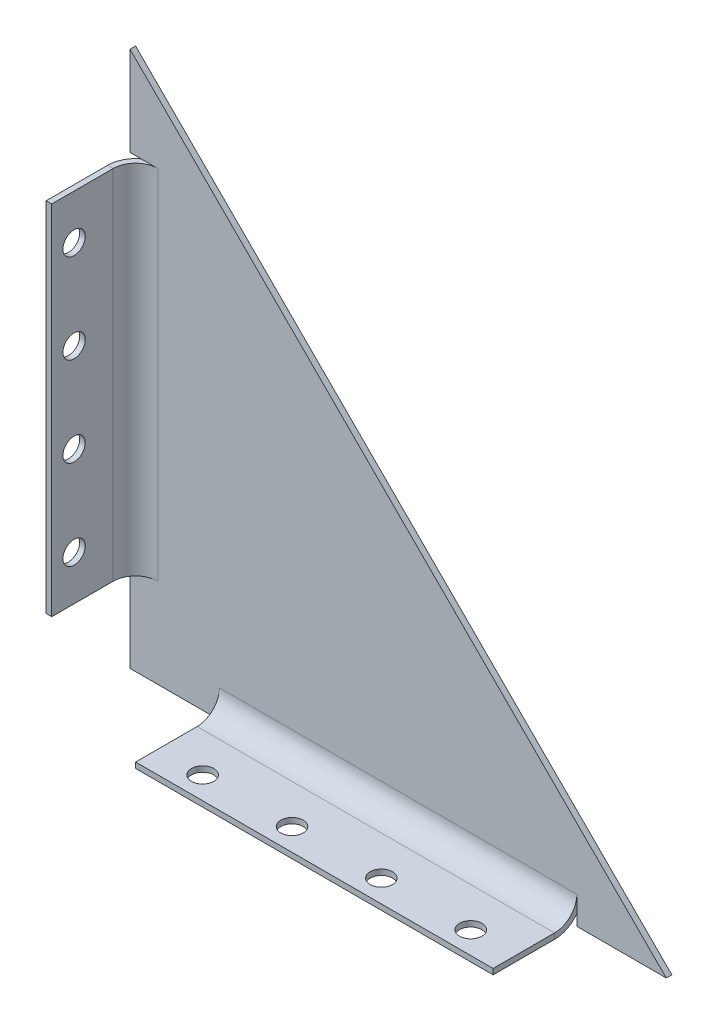
ISO-10303-21;
HEADER;
FILE_DESCRIPTION(('STEP AP214'),'2;1');
FILE_NAME('part.step','',(''),(''),'','','');
FILE_SCHEMA(('AUTOMOTIVE_DESIGN { 1 0 10303 214 1 1 1 1 }'));
ENDSEC;
DATA;
#1=APPLICATION_CONTEXT('core data for automotive mechanical design processes');
#2=APPLICATION_PROTOCOL_DEFINITION('international standard','automotive_design',2000,#1);
#3=PRODUCT_CONTEXT('',#1,'mechanical');
#4=PRODUCT('Part','Part','',(#3));
#5=PRODUCT_RELATED_PRODUCT_CATEGORY('part','',(#4));
#6=PRODUCT_DEFINITION_FORMATION('','',#4);
#7=PRODUCT_DEFINITION_CONTEXT('part definition',#1,'design');
#8=PRODUCT_DEFINITION('design','',#6,#7);
#9=PRODUCT_DEFINITION_SHAPE('','',#8);
#10=(LENGTH_UNIT() NAMED_UNIT(*) SI_UNIT(.MILLI.,.METRE.));
#11=(NAMED_UNIT(*) PLANE_ANGLE_UNIT() SI_UNIT($,.RADIAN.));
#12=(NAMED_UNIT(*) SI_UNIT($,.STERADIAN.) SOLID_ANGLE_UNIT());
#13=UNCERTAINTY_MEASURE_WITH_UNIT(LENGTH_MEASURE(1.E-05),#10,'distance_accuracy_value','');
#14=(GEOMETRIC_REPRESENTATION_CONTEXT(3) GLOBAL_UNCERTAINTY_ASSIGNED_CONTEXT((#13)) GLOBAL_UNIT_ASSIGNED_CONTEXT((#10,
#11,#12)) REPRESENTATION_CONTEXT('',''));
#15=CARTESIAN_POINT('',(0.,0.,0.));
#16=DIRECTION('',(0.,0.,1.));
#17=DIRECTION('',(1.,0.,0.));
#18=AXIS2_PLACEMENT_3D('',#15,#16,#17);
#19=CARTESIAN_POINT('',(127.,-32.9435568006634,1.58750000000001));
#20=DIRECTION('',(-1.,0.,0.));
#21=DIRECTION('',(0.,0.,1.));
#22=AXIS2_PLACEMENT_3D('',#19,#20,#21);
#23=PLANE('',#22);
#24=DIRECTION('',(0.,1.,0.));
#25=VECTOR('',#24,1.);
#26=CARTESIAN_POINT('',(127.,-32.9435568006634,1.58750000000001));
#27=LINE('',#26,#25);
#28=CARTESIAN_POINT('',(127.,-32.9181568006634,1.58750000000001));
#29=VERTEX_POINT('',#28);
#30=CARTESIAN_POINT('',(127.,-29.7685568006634,1.58750000000001));
#31=VERTEX_POINT('',#30);
#32=EDGE_CURVE('E287',#29,#31,#27,.T.);
#33=ORIENTED_EDGE('',*,*,#32,.T.);
#34=CARTESIAN_POINT('',(127.,-25.0060568006634,7.93750000000001));
#35=DIRECTION('',(1.,0.,0.));
#36=DIRECTION('',(0.,0.,-1.));
#37=AXIS2_PLACEMENT_3D('',#34,#35,#36);
#38=CIRCLE('',#37,7.9375);
#39=CARTESIAN_POINT('',(127.,-25.0060568006634,0.));
#40=VERTEX_POINT('',#39);
#41=EDGE_CURVE('E13',#31,#40,#38,.T.);
#42=ORIENTED_EDGE('',*,*,#41,.T.);
#43=DIRECTION('',(0.,-1.,0.));
#44=VECTOR('',#43,1.);
#45=CARTESIAN_POINT('',(127.,0.,0.));
#46=LINE('',#45,#44);
#47=CARTESIAN_POINT('',(127.,-32.9181568006634,0.));
#48=VERTEX_POINT('',#47);
#49=EDGE_CURVE('E293',#40,#48,#46,.T.);
#50=ORIENTED_EDGE('',*,*,#49,.T.);
#51=DIRECTION('',(0.,0.,1.));
#52=VECTOR('',#51,1.);
#53=CARTESIAN_POINT('',(127.,-32.9181568006634,1.58750000000001));
#54=LINE('',#53,#52);
#55=EDGE_CURVE('E306',#48,#29,#54,.T.);
#56=ORIENTED_EDGE('',*,*,#55,.T.);
#57=EDGE_LOOP('',(#33,#42,#50,#56));
#58=FACE_BOUND('',#57,.T.);
#59=ADVANCED_FACE('F79',(#58),#23,.T.);
#60=CARTESIAN_POINT('',(25.4,-25.0060568006634,1.5875));
#61=DIRECTION('',(1.,0.,0.));
#62=DIRECTION('',(0.,1.,0.));
#63=AXIS2_PLACEMENT_3D('',#60,#61,#62);
#64=PLANE('',#63);
#65=DIRECTION('',(0.,1.,0.));
#66=VECTOR('',#65,1.);
#67=CARTESIAN_POINT('',(25.4,0.,0.));
#68=LINE('',#67,#66);
#69=CARTESIAN_POINT('',(25.4,-32.9181568006634,0.));
#70=VERTEX_POINT('',#69);
#71=CARTESIAN_POINT('',(25.4,-25.0060568006634,0.));
#72=VERTEX_POINT('',#71);
#73=EDGE_CURVE('E290',#70,#72,#68,.T.);
#74=ORIENTED_EDGE('',*,*,#73,.T.);
#75=CARTESIAN_POINT('',(25.4,-25.0060568006634,7.9375));
#76=DIRECTION('',(1.,0.,0.));
#77=DIRECTION('',(0.,0.,-1.));
#78=AXIS2_PLACEMENT_3D('',#75,#76,#77);
#79=CIRCLE('',#78,7.9375);
#80=CARTESIAN_POINT('',(25.4,-29.7685568006634,1.5875));
#81=VERTEX_POINT('',#80);
#82=EDGE_CURVE('E270',#72,#81,#79,.F.);
#83=ORIENTED_EDGE('',*,*,#82,.T.);
#84=DIRECTION('',(0.,-1.,0.));
#85=VECTOR('',#84,1.);
#86=CARTESIAN_POINT('',(25.4,-25.0060568006634,1.5875));
#87=LINE('',#86,#85);
#88=CARTESIAN_POINT('',(25.4,-32.9181568006634,1.5875));
#89=VERTEX_POINT('',#88);
#90=EDGE_CURVE('E272',#81,#89,#87,.T.);
#91=ORIENTED_EDGE('',*,*,#90,.T.);
#92=DIRECTION('',(0.,0.,-1.));
#93=VECTOR('',#92,1.);
#94=CARTESIAN_POINT('',(25.4,-32.9181568006634,1.5875));
#95=LINE('',#94,#93);
#96=EDGE_CURVE('E296',#89,#70,#95,.T.);
#97=ORIENTED_EDGE('',*,*,#96,.T.);
#98=EDGE_LOOP('',(#74,#83,#91,#97));
#99=FACE_BOUND('',#98,.T.);
#100=ADVANCED_FACE('F317',(#99),#64,.T.);
#101=CARTESIAN_POINT('',(0.,0.,1.5875));
#102=DIRECTION('',(0.,0.,1.));
#103=DIRECTION('',(1.,0.,0.));
#104=AXIS2_PLACEMENT_3D('',#101,#102,#103);
#105=PLANE('',#104);
#106=DIRECTION('',(1.,0.,0.));
#107=VECTOR('',#106,1.);
#108=CARTESIAN_POINT('',(127.,-25.0060568006634,1.58750000000001));
#109=LINE('',#108,#107);
#110=CARTESIAN_POINT('',(127.,-25.0060568006634,1.5875));
#111=VERTEX_POINT('',#110);
#112=CARTESIAN_POINT('',(25.4,-25.0060568006634,1.5875));
#113=VERTEX_POINT('',#112);
#114=EDGE_CURVE('E102',#111,#113,#109,.F.);
#115=ORIENTED_EDGE('',*,*,#114,.F.);
#116=EDGE_CURVE('E83',#31,#111,#27,.T.);
#117=ORIENTED_EDGE('',*,*,#116,.F.);
#118=ORIENTED_EDGE('',*,*,#32,.F.);
#119=DIRECTION('',(1.,0.,0.));
#120=VECTOR('',#119,1.);
#121=CARTESIAN_POINT('',(0.,-32.9181568006634,1.5875));
#122=LINE('',#121,#120);
#123=CARTESIAN_POINT('',(152.4,-32.9181568006634,1.5875));
#124=VERTEX_POINT('',#123);
#125=EDGE_CURVE('E386',#29,#124,#122,.T.);
#126=ORIENTED_EDGE('',*,*,#125,.T.);
#127=DIRECTION('',(-0.707106781186548,0.707106781186547,0.));
#128=VECTOR('',#127,1.);
#129=CARTESIAN_POINT('',(152.4,-32.9181568006634,1.5875));
#130=LINE('',#129,#128);
#131=CARTESIAN_POINT('',(0.,119.481843199337,1.5875));
#132=VERTEX_POINT('',#131);
#133=EDGE_CURVE('E354',#124,#132,#130,.T.);
#134=ORIENTED_EDGE('',*,*,#133,.T.);
#135=DIRECTION('',(0.,-1.,0.));
#136=VECTOR('',#135,1.);
#137=CARTESIAN_POINT('',(0.,119.481843199337,1.5875));
#138=LINE('',#137,#136);
#139=CARTESIAN_POINT('',(0.,94.0818431993366,1.5875));
#140=VERTEX_POINT('',#139);
#141=EDGE_CURVE('E394',#132,#140,#138,.T.);
#142=ORIENTED_EDGE('',*,*,#141,.T.);
#143=DIRECTION('',(-1.,0.,0.));
#144=VECTOR('',#143,1.);
#145=CARTESIAN_POINT('',(7.91209999999998,94.0818431993366,1.5875));
#146=LINE('',#145,#144);
#147=CARTESIAN_POINT('',(3.14959999999997,94.0818431993366,1.5875));
#148=VERTEX_POINT('',#147);
#149=EDGE_CURVE('E435',#148,#140,#146,.T.);
#150=ORIENTED_EDGE('',*,*,#149,.F.);
#151=CARTESIAN_POINT('',(7.91209999999998,94.0818431993366,1.5875));
#152=VERTEX_POINT('',#151);
#153=EDGE_CURVE('E437',#152,#148,#146,.T.);
#154=ORIENTED_EDGE('',*,*,#153,.F.);
#155=DIRECTION('',(0.,-1.,0.));
#156=VECTOR('',#155,1.);
#157=CARTESIAN_POINT('',(7.91209999999998,-7.51815680066342,1.58750000000001));
#158=LINE('',#157,#156);
#159=CARTESIAN_POINT('',(7.91209999999998,-7.51815680066342,1.5875));
#160=VERTEX_POINT('',#159);
#161=EDGE_CURVE('E469',#160,#152,#158,.F.);
#162=ORIENTED_EDGE('',*,*,#161,.F.);
#163=DIRECTION('',(1.,0.,0.));
#164=VECTOR('',#163,1.);
#165=CARTESIAN_POINT('',(-0.0254,-7.51815680066342,1.58750000000001));
#166=LINE('',#165,#164);
#167=CARTESIAN_POINT('',(3.14959999999997,-7.51815680066342,1.58750000000001));
#168=VERTEX_POINT('',#167);
#169=EDGE_CURVE('E439',#168,#160,#166,.T.);
#170=ORIENTED_EDGE('',*,*,#169,.F.);
#171=CARTESIAN_POINT('',(0.,-7.51815680066342,1.58750000000001));
#172=VERTEX_POINT('',#171);
#173=EDGE_CURVE('E425',#172,#168,#166,.T.);
#174=ORIENTED_EDGE('',*,*,#173,.F.);
#175=CARTESIAN_POINT('',(0.,-32.9181568006634,1.5875));
#176=VERTEX_POINT('',#175);
#177=EDGE_CURVE('E392',#172,#176,#138,.T.);
#178=ORIENTED_EDGE('',*,*,#177,.T.);
#179=EDGE_CURVE('E362',#176,#89,#122,.T.);
#180=ORIENTED_EDGE('',*,*,#179,.T.);
#181=ORIENTED_EDGE('',*,*,#90,.F.);
#182=EDGE_CURVE('E308',#113,#81,#87,.T.);
#183=ORIENTED_EDGE('',*,*,#182,.F.);
#184=EDGE_LOOP('',(#115,#117,#118,#126,#134,#142,#150,#154,#162,#170,#174,#178,#180,#181,#183));
#185=FACE_BOUND('',#184,.T.);
#186=ADVANCED_FACE('F405',(#185),#105,.T.);
#187=CARTESIAN_POINT('',(0.,0.,0.));
#188=DIRECTION('',(0.,0.,1.));
#189=DIRECTION('',(1.,0.,0.));
#190=AXIS2_PLACEMENT_3D('',#187,#188,#189);
#191=PLANE('',#190);
#192=ORIENTED_EDGE('',*,*,#49,.F.);
#193=DIRECTION('',(1.,0.,0.));
#194=VECTOR('',#193,1.);
#195=CARTESIAN_POINT('',(127.,-25.0060568006634,0.));
#196=LINE('',#195,#194);
#197=EDGE_CURVE('E267',#40,#72,#196,.F.);
#198=ORIENTED_EDGE('',*,*,#197,.T.);
#199=ORIENTED_EDGE('',*,*,#73,.F.);
#200=DIRECTION('',(1.,0.,0.));
#201=VECTOR('',#200,1.);
#202=CARTESIAN_POINT('',(0.,-32.9181568006634,0.));
#203=LINE('',#202,#201);
#204=CARTESIAN_POINT('',(0.,-32.9181568006634,0.));
#205=VERTEX_POINT('',#204);
#206=EDGE_CURVE('E351',#205,#70,#203,.T.);
#207=ORIENTED_EDGE('',*,*,#206,.F.);
#208=DIRECTION('',(0.,1.,0.));
#209=VECTOR('',#208,1.);
#210=CARTESIAN_POINT('',(0.,0.,0.));
#211=LINE('',#210,#209);
#212=CARTESIAN_POINT('',(0.,-7.51815680066342,0.));
#213=VERTEX_POINT('',#212);
#214=EDGE_CURVE('E357',#213,#205,#211,.F.);
#215=ORIENTED_EDGE('',*,*,#214,.F.);
#216=DIRECTION('',(-1.,0.,0.));
#217=VECTOR('',#216,1.);
#218=CARTESIAN_POINT('',(0.,-7.51815680066341,0.));
#219=LINE('',#218,#217);
#220=CARTESIAN_POINT('',(7.91209999999998,-7.51815680066342,0.));
#221=VERTEX_POINT('',#220);
#222=EDGE_CURVE('E412',#221,#213,#219,.T.);
#223=ORIENTED_EDGE('',*,*,#222,.F.);
#224=DIRECTION('',(0.,-1.,0.));
#225=VECTOR('',#224,1.);
#226=CARTESIAN_POINT('',(7.91209999999998,-7.51815680066342,0.));
#227=LINE('',#226,#225);
#228=CARTESIAN_POINT('',(7.91209999999998,94.0818431993366,0.));
#229=VERTEX_POINT('',#228);
#230=EDGE_CURVE('E460',#221,#229,#227,.F.);
#231=ORIENTED_EDGE('',*,*,#230,.T.);
#232=DIRECTION('',(1.,0.,0.));
#233=VECTOR('',#232,1.);
#234=CARTESIAN_POINT('',(0.,94.0818431993366,0.));
#235=LINE('',#234,#233);
#236=CARTESIAN_POINT('',(0.,94.0818431993366,0.));
#237=VERTEX_POINT('',#236);
#238=EDGE_CURVE('E421',#237,#229,#235,.T.);
#239=ORIENTED_EDGE('',*,*,#238,.F.);
#240=CARTESIAN_POINT('',(0.,119.481843199337,0.));
#241=VERTEX_POINT('',#240);
#242=EDGE_CURVE('E352',#241,#237,#211,.F.);
#243=ORIENTED_EDGE('',*,*,#242,.F.);
#244=DIRECTION('',(-0.707106781186548,0.707106781186547,0.));
#245=VECTOR('',#244,1.);
#246=CARTESIAN_POINT('',(152.4,-32.9181568006634,0.));
#247=LINE('',#246,#245);
#248=CARTESIAN_POINT('',(152.4,-32.9181568006634,0.));
#249=VERTEX_POINT('',#248);
#250=EDGE_CURVE('E347',#249,#241,#247,.T.);
#251=ORIENTED_EDGE('',*,*,#250,.F.);
#252=EDGE_CURVE('E344',#48,#249,#203,.T.);
#253=ORIENTED_EDGE('',*,*,#252,.F.);
#254=EDGE_LOOP('',(#192,#198,#199,#207,#215,#223,#231,#239,#243,#251,#253));
#255=FACE_BOUND('',#254,.T.);
#256=ADVANCED_FACE('F342',(#255),#191,.F.);
#257=CARTESIAN_POINT('',(0.,-32.9181568006634,1.5875));
#258=DIRECTION('',(0.,-1.,0.));
#259=DIRECTION('',(1.,0.,0.));
#260=AXIS2_PLACEMENT_3D('',#257,#258,#259);
#261=PLANE('',#260);
#262=ORIENTED_EDGE('',*,*,#96,.F.);
#263=ORIENTED_EDGE('',*,*,#179,.F.);
#264=DIRECTION('',(0.,0.,1.));
#265=VECTOR('',#264,1.);
#266=CARTESIAN_POINT('',(0.,-32.9181568006634,1.5875));
#267=LINE('',#266,#265);
#268=EDGE_CURVE('E377',#205,#176,#267,.T.);
#269=ORIENTED_EDGE('',*,*,#268,.F.);
#270=ORIENTED_EDGE('',*,*,#206,.T.);
#271=EDGE_LOOP('',(#262,#263,#269,#270));
#272=FACE_BOUND('',#271,.T.);
#273=ADVANCED_FACE('F408',(#272),#261,.T.);
#274=CARTESIAN_POINT('',(-0.0254,-7.51815680066342,1.58750000000001));
#275=DIRECTION('',(0.,1.,0.));
#276=DIRECTION('',(0.,0.,1.));
#277=AXIS2_PLACEMENT_3D('',#274,#275,#276);
#278=PLANE('',#277);
#279=ORIENTED_EDGE('',*,*,#173,.T.);
#280=CARTESIAN_POINT('',(7.91209999999998,-7.51815680066342,7.93750000000001));
#281=DIRECTION('',(0.,-1.,0.));
#282=DIRECTION('',(0.,0.,-1.));
#283=AXIS2_PLACEMENT_3D('',#280,#281,#282);
#284=CIRCLE('',#283,7.9375);
#285=EDGE_CURVE('E89',#168,#221,#284,.T.);
#286=ORIENTED_EDGE('',*,*,#285,.T.);
#287=ORIENTED_EDGE('',*,*,#222,.T.);
#288=DIRECTION('',(0.,0.,1.));
#289=VECTOR('',#288,1.);
#290=CARTESIAN_POINT('',(0.,-7.51815680066342,1.58750000000001));
#291=LINE('',#290,#289);
#292=EDGE_CURVE('E418',#213,#172,#291,.T.);
#293=ORIENTED_EDGE('',*,*,#292,.T.);
#294=EDGE_LOOP('',(#279,#286,#287,#293));
#295=FACE_BOUND('',#294,.T.);
#296=ADVANCED_FACE('F417',(#295),#278,.T.);
#297=CARTESIAN_POINT('',(7.91209999999998,94.0818431993366,1.5875));
#298=DIRECTION('',(0.,-1.,0.));
#299=DIRECTION('',(0.,0.,-1.));
#300=AXIS2_PLACEMENT_3D('',#297,#298,#299);
#301=PLANE('',#300);
#302=ORIENTED_EDGE('',*,*,#238,.T.);
#303=CARTESIAN_POINT('',(7.91209999999998,94.0818431993366,7.93749999999999));
#304=DIRECTION('',(0.,-1.,0.));
#305=DIRECTION('',(0.,0.,-1.));
#306=AXIS2_PLACEMENT_3D('',#303,#304,#305);
#307=CIRCLE('',#306,7.9375);
#308=EDGE_CURVE('E438',#229,#148,#307,.F.);
#309=ORIENTED_EDGE('',*,*,#308,.T.);
#310=ORIENTED_EDGE('',*,*,#149,.T.);
#311=DIRECTION('',(0.,0.,-1.));
#312=VECTOR('',#311,1.);
#313=CARTESIAN_POINT('',(0.,94.0818431993366,1.5875));
#314=LINE('',#313,#312);
#315=EDGE_CURVE('E420',#140,#237,#314,.T.);
#316=ORIENTED_EDGE('',*,*,#315,.T.);
#317=EDGE_LOOP('',(#302,#309,#310,#316));
#318=FACE_BOUND('',#317,.T.);
#319=ADVANCED_FACE('F946',(#318),#301,.T.);
#320=CARTESIAN_POINT('',(0.,119.481843199337,1.5875));
#321=DIRECTION('',(-1.,0.,0.));
#322=DIRECTION('',(0.,-1.,0.));
#323=AXIS2_PLACEMENT_3D('',#320,#321,#322);
#324=PLANE('',#323);
#325=ORIENTED_EDGE('',*,*,#292,.F.);
#326=ORIENTED_EDGE('',*,*,#214,.T.);
#327=ORIENTED_EDGE('',*,*,#268,.T.);
#328=ORIENTED_EDGE('',*,*,#177,.F.);
#329=EDGE_LOOP('',(#325,#326,#327,#328));
#330=FACE_BOUND('',#329,.T.);
#331=ADVANCED_FACE('F843',(#330),#324,.T.);
#332=ORIENTED_EDGE('',*,*,#55,.F.);
#333=ORIENTED_EDGE('',*,*,#252,.T.);
#334=DIRECTION('',(0.,0.,1.));
#335=VECTOR('',#334,1.);
#336=CARTESIAN_POINT('',(152.4,-32.9181568006634,1.5875));
#337=LINE('',#336,#335);
#338=EDGE_CURVE('E370',#249,#124,#337,.T.);
#339=ORIENTED_EDGE('',*,*,#338,.T.);
#340=ORIENTED_EDGE('',*,*,#125,.F.);
#341=EDGE_LOOP('',(#332,#333,#339,#340));
#342=FACE_BOUND('',#341,.T.);
#343=ADVANCED_FACE('F385',(#342),#261,.T.);
#344=CARTESIAN_POINT('',(152.4,-32.9181568006634,1.5875));
#345=DIRECTION('',(0.707106781186547,0.707106781186548,0.));
#346=DIRECTION('',(-0.707106781186548,0.707106781186547,0.));
#347=AXIS2_PLACEMENT_3D('',#344,#345,#346);
#348=PLANE('',#347);
#349=ORIENTED_EDGE('',*,*,#338,.F.);
#350=ORIENTED_EDGE('',*,*,#250,.T.);
#351=DIRECTION('',(0.,0.,1.));
#352=VECTOR('',#351,1.);
#353=CARTESIAN_POINT('',(0.,119.481843199337,1.5875));
#354=LINE('',#353,#352);
#355=EDGE_CURVE('E376',#241,#132,#354,.T.);
#356=ORIENTED_EDGE('',*,*,#355,.T.);
#357=ORIENTED_EDGE('',*,*,#133,.F.);
#358=EDGE_LOOP('',(#349,#350,#356,#357));
#359=FACE_BOUND('',#358,.T.);
#360=ADVANCED_FACE('F389',(#359),#348,.T.);
#361=ORIENTED_EDGE('',*,*,#315,.F.);
#362=ORIENTED_EDGE('',*,*,#141,.F.);
#363=ORIENTED_EDGE('',*,*,#355,.F.);
#364=ORIENTED_EDGE('',*,*,#242,.T.);
#365=EDGE_LOOP('',(#361,#362,#363,#364));
#366=FACE_BOUND('',#365,.T.);
#367=ADVANCED_FACE('F81',(#366),#324,.T.);
#368=CARTESIAN_POINT('',(7.91209999999998,94.0818431993366,7.93749999999999));
#369=DIRECTION('',(0.,1.,0.));
#370=DIRECTION('',(0.,0.,1.));
#371=AXIS2_PLACEMENT_3D('',#368,#369,#370);
#372=PLANE('',#371);
#373=CARTESIAN_POINT('',(7.91209999999998,94.0818431993366,7.93749999999999));
#374=DIRECTION('',(0.,-1.,0.));
#375=DIRECTION('',(0.,0.,-1.));
#376=AXIS2_PLACEMENT_3D('',#373,#374,#375);
#377=CIRCLE('',#376,6.35);
#378=CARTESIAN_POINT('',(1.56209999999998,94.0818431993366,7.93749999999997));
#379=VERTEX_POINT('',#378);
#380=EDGE_CURVE('E465',#152,#379,#377,.F.);
#381=ORIENTED_EDGE('',*,*,#380,.F.);
#382=ORIENTED_EDGE('',*,*,#153,.T.);
#383=CARTESIAN_POINT('',(-0.0254000000000226,94.0818431993366,7.93749999999997));
#384=VERTEX_POINT('',#383);
#385=EDGE_CURVE('E466',#148,#384,#307,.F.);
#386=ORIENTED_EDGE('',*,*,#385,.T.);
#387=DIRECTION('',(-1.,0.,0.));
#388=VECTOR('',#387,1.);
#389=CARTESIAN_POINT('',(-0.0254000000000222,94.0818431993366,7.93749999999997));
#390=LINE('',#389,#388);
#391=EDGE_CURVE('E504',#379,#384,#390,.T.);
#392=ORIENTED_EDGE('',*,*,#391,.F.);
#393=EDGE_LOOP('',(#381,#382,#386,#392));
#394=FACE_BOUND('',#393,.T.);
#395=ADVANCED_FACE('F896',(#394),#372,.T.);
#396=CARTESIAN_POINT('',(7.91209999999998,-7.51815680066342,7.93750000000001));
#397=DIRECTION('',(0.,1.,0.));
#398=DIRECTION('',(0.,0.,1.));
#399=AXIS2_PLACEMENT_3D('',#396,#397,#398);
#400=PLANE('',#399);
#401=CARTESIAN_POINT('',(-0.0254000000000222,-7.51815680066342,7.93749999999998));
#402=VERTEX_POINT('',#401);
#403=EDGE_CURVE('E383',#402,#168,#284,.T.);
#404=ORIENTED_EDGE('',*,*,#403,.T.);
#405=ORIENTED_EDGE('',*,*,#169,.T.);
#406=CARTESIAN_POINT('',(7.91209999999998,-7.51815680066342,7.93750000000001));
#407=DIRECTION('',(0.,-1.,0.));
#408=DIRECTION('',(0.,0.,-1.));
#409=AXIS2_PLACEMENT_3D('',#406,#407,#408);
#410=CIRCLE('',#409,6.35);
#411=CARTESIAN_POINT('',(1.56209999999998,-7.51815680066342,7.93749999999999));
#412=VERTEX_POINT('',#411);
#413=EDGE_CURVE('E474',#412,#160,#410,.T.);
#414=ORIENTED_EDGE('',*,*,#413,.F.);
#415=DIRECTION('',(-1.,0.,0.));
#416=VECTOR('',#415,1.);
#417=CARTESIAN_POINT('',(1.56209999999998,-7.51815680066342,7.93749999999999));
#418=LINE('',#417,#416);
#419=EDGE_CURVE('E463',#412,#402,#418,.T.);
#420=ORIENTED_EDGE('',*,*,#419,.T.);
#421=EDGE_LOOP('',(#404,#405,#414,#420));
#422=FACE_BOUND('',#421,.T.);
#423=ADVANCED_FACE('F461',(#422),#400,.F.);
#424=CARTESIAN_POINT('',(7.91209999999998,-7.51815680066342,7.93750000000001));
#425=DIRECTION('',(0.,-1.,0.));
#426=DIRECTION('',(-1.,0.,0.));
#427=AXIS2_PLACEMENT_3D('',#424,#425,#426);
#428=CYLINDRICAL_SURFACE('',#427,7.9375);
#429=ORIENTED_EDGE('',*,*,#230,.F.);
#430=ORIENTED_EDGE('',*,*,#285,.F.);
#431=ORIENTED_EDGE('',*,*,#403,.F.);
#432=DIRECTION('',(0.,-1.,0.));
#433=VECTOR('',#432,1.);
#434=CARTESIAN_POINT('',(-0.0254000000000222,0.,7.93749999999998));
#435=LINE('',#434,#433);
#436=EDGE_CURVE('E499',#384,#402,#435,.T.);
#437=ORIENTED_EDGE('',*,*,#436,.F.);
#438=ORIENTED_EDGE('',*,*,#385,.F.);
#439=ORIENTED_EDGE('',*,*,#308,.F.);
#440=EDGE_LOOP('',(#429,#430,#431,#437,#438,#439));
#441=FACE_BOUND('',#440,.T.);
#442=ADVANCED_FACE('F456',(#441),#428,.T.);
#443=CARTESIAN_POINT('',(7.91209999999998,-7.51815680066342,7.93750000000001));
#444=DIRECTION('',(0.,-1.,0.));
#445=DIRECTION('',(-1.,0.,0.));
#446=AXIS2_PLACEMENT_3D('',#443,#444,#445);
#447=CYLINDRICAL_SURFACE('',#446,6.35);
#448=ORIENTED_EDGE('',*,*,#161,.T.);
#449=ORIENTED_EDGE('',*,*,#380,.T.);
#450=DIRECTION('',(0.,1.,0.));
#451=VECTOR('',#450,1.);
#452=CARTESIAN_POINT('',(1.56209999999998,94.0818431993366,7.93749999999998));
#453=LINE('',#452,#451);
#454=EDGE_CURVE('E502',#379,#412,#453,.F.);
#455=ORIENTED_EDGE('',*,*,#454,.T.);
#456=ORIENTED_EDGE('',*,*,#413,.T.);
#457=EDGE_LOOP('',(#448,#449,#455,#456));
#458=FACE_BOUND('',#457,.T.);
#459=ADVANCED_FACE('F523',(#458),#447,.F.);
#460=CARTESIAN_POINT('',(-0.0254000000000001,-7.51815680066342,1.58750000000001));
#461=DIRECTION('',(0.,-1.,0.));
#462=DIRECTION('',(0.,0.,-1.));
#463=AXIS2_PLACEMENT_3D('',#460,#461,#462);
#464=PLANE('',#463);
#465=DIRECTION('',(0.,0.,-1.));
#466=VECTOR('',#465,1.);
#467=CARTESIAN_POINT('',(-0.0254,-7.51815680066342,1.58750000000001));
#468=LINE('',#467,#466);
#469=CARTESIAN_POINT('',(-0.0254000000000831,-7.51815680066342,25.4));
#470=VERTEX_POINT('',#469);
#471=EDGE_CURVE('E483',#470,#402,#468,.T.);
#472=ORIENTED_EDGE('',*,*,#471,.T.);
#473=ORIENTED_EDGE('',*,*,#419,.F.);
#474=DIRECTION('',(0.,0.,1.));
#475=VECTOR('',#474,1.);
#476=CARTESIAN_POINT('',(1.56210000000001,-7.51815680066342,0.));
#477=LINE('',#476,#475);
#478=CARTESIAN_POINT('',(1.56209999999992,-7.51815680066342,25.4));
#479=VERTEX_POINT('',#478);
#480=EDGE_CURVE('E492',#479,#412,#477,.F.);
#481=ORIENTED_EDGE('',*,*,#480,.F.);
#482=DIRECTION('',(1.,0.,0.));
#483=VECTOR('',#482,1.);
#484=CARTESIAN_POINT('',(-0.0254000000000831,-7.51815680066342,25.4));
#485=LINE('',#484,#483);
#486=EDGE_CURVE('E475',#470,#479,#485,.T.);
#487=ORIENTED_EDGE('',*,*,#486,.F.);
#488=EDGE_LOOP('',(#472,#473,#481,#487));
#489=FACE_BOUND('',#488,.T.);
#490=ADVANCED_FACE('F521',(#489),#464,.T.);
#491=CARTESIAN_POINT('',(-0.0254000000000831,94.0818431993366,25.4));
#492=DIRECTION('',(0.,1.,0.));
#493=DIRECTION('',(-1.,0.,0.));
#494=AXIS2_PLACEMENT_3D('',#491,#492,#493);
#495=PLANE('',#494);
#496=DIRECTION('',(0.,0.,-1.));
#497=VECTOR('',#496,1.);
#498=CARTESIAN_POINT('',(1.56210000000001,94.0818431993366,0.));
#499=LINE('',#498,#497);
#500=CARTESIAN_POINT('',(1.56209999999992,94.0818431993366,25.4));
#501=VERTEX_POINT('',#500);
#502=EDGE_CURVE('E497',#379,#501,#499,.F.);
#503=ORIENTED_EDGE('',*,*,#502,.F.);
#504=ORIENTED_EDGE('',*,*,#391,.T.);
#505=DIRECTION('',(0.,0.,1.));
#506=VECTOR('',#505,1.);
#507=CARTESIAN_POINT('',(-0.0254000000000831,94.0818431993366,25.4));
#508=LINE('',#507,#506);
#509=CARTESIAN_POINT('',(-0.0254000000000831,94.0818431993366,25.4));
#510=VERTEX_POINT('',#509);
#511=EDGE_CURVE('E490',#384,#510,#508,.T.);
#512=ORIENTED_EDGE('',*,*,#511,.T.);
#513=DIRECTION('',(1.,0.,0.));
#514=VECTOR('',#513,1.);
#515=CARTESIAN_POINT('',(-0.0254000000000831,94.0818431993366,25.4));
#516=LINE('',#515,#514);
#517=EDGE_CURVE('E477',#510,#501,#516,.T.);
#518=ORIENTED_EDGE('',*,*,#517,.T.);
#519=EDGE_LOOP('',(#503,#504,#512,#518));
#520=FACE_BOUND('',#519,.T.);
#521=ADVANCED_FACE('F509',(#520),#495,.T.);
#522=CARTESIAN_POINT('',(-0.0253999999999944,0.,0.));
#523=DIRECTION('',(-1.,0.,0.));
#524=DIRECTION('',(0.,0.,1.));
#525=AXIS2_PLACEMENT_3D('',#522,#523,#524);
#526=PLANE('',#525);
#527=CARTESIAN_POINT('',(-0.0254000000000609,5.18184319933658,19.0499999999993));
#528=DIRECTION('',(-1.,0.,0.));
#529=DIRECTION('',(0.,0.,1.));
#530=AXIS2_PLACEMENT_3D('',#527,#528,#529);
#531=CIRCLE('',#530,3.175);
#532=CARTESIAN_POINT('',(-0.025400000000072,5.18184319933658,22.2249999999993));
#533=VERTEX_POINT('',#532);
#534=EDGE_CURVE('E758',#533,#533,#531,.T.);
#535=ORIENTED_EDGE('',*,*,#534,.F.);
#536=EDGE_LOOP('',(#535));
#537=FACE_BOUND('',#536,.T.);
#538=CARTESIAN_POINT('',(-0.0254000000000609,30.5818431993366,19.0499999999995));
#539=DIRECTION('',(-1.,0.,0.));
#540=DIRECTION('',(0.,0.,1.));
#541=AXIS2_PLACEMENT_3D('',#538,#539,#540);
#542=CIRCLE('',#541,3.175);
#543=CARTESIAN_POINT('',(-0.025400000000072,30.5818431993366,22.2249999999995));
#544=VERTEX_POINT('',#543);
#545=EDGE_CURVE('E763',#544,#544,#542,.T.);
#546=ORIENTED_EDGE('',*,*,#545,.F.);
#547=EDGE_LOOP('',(#546));
#548=FACE_BOUND('',#547,.T.);
#549=CARTESIAN_POINT('',(-0.0254000000000609,55.9818431993366,19.0499999999997));
#550=DIRECTION('',(-1.,0.,0.));
#551=DIRECTION('',(0.,0.,1.));
#552=AXIS2_PLACEMENT_3D('',#549,#550,#551);
#553=CIRCLE('',#552,3.175);
#554=CARTESIAN_POINT('',(-0.025400000000072,55.9818431993366,22.2249999999997));
#555=VERTEX_POINT('',#554);
#556=EDGE_CURVE('E565',#555,#555,#553,.T.);
#557=ORIENTED_EDGE('',*,*,#556,.F.);
#558=EDGE_LOOP('',(#557));
#559=FACE_BOUND('',#558,.T.);
#560=CARTESIAN_POINT('',(-0.0254000000000609,81.3818431993366,19.05));
#561=DIRECTION('',(-1.,0.,0.));
#562=DIRECTION('',(0.,0.,1.));
#563=AXIS2_PLACEMENT_3D('',#560,#561,#562);
#564=CIRCLE('',#563,3.175);
#565=CARTESIAN_POINT('',(-0.025400000000072,81.3818431993366,22.225));
#566=VERTEX_POINT('',#565);
#567=EDGE_CURVE('E564',#566,#566,#564,.T.);
#568=ORIENTED_EDGE('',*,*,#567,.F.);
#569=EDGE_LOOP('',(#568));
#570=FACE_BOUND('',#569,.T.);
#571=ORIENTED_EDGE('',*,*,#511,.F.);
#572=ORIENTED_EDGE('',*,*,#436,.T.);
#573=ORIENTED_EDGE('',*,*,#471,.F.);
#574=DIRECTION('',(0.,-1.,0.));
#575=VECTOR('',#574,1.);
#576=CARTESIAN_POINT('',(-0.0254000000000831,-7.51815680066342,25.4));
#577=LINE('',#576,#575);
#578=EDGE_CURVE('E488',#510,#470,#577,.T.);
#579=ORIENTED_EDGE('',*,*,#578,.F.);
#580=EDGE_LOOP('',(#571,#572,#573,#579));
#581=FACE_BOUND('',#580,.T.);
#582=ADVANCED_FACE('F513',(#537,#548,#559,#570,#581),#526,.T.);
#583=CARTESIAN_POINT('',(1.56210000000001,0.,0.));
#584=DIRECTION('',(-1.,0.,0.));
#585=DIRECTION('',(0.,0.,1.));
#586=AXIS2_PLACEMENT_3D('',#583,#584,#585);
#587=PLANE('',#586);
#588=CARTESIAN_POINT('',(1.56209999999994,5.18184319933658,19.0499999999993));
#589=DIRECTION('',(1.,0.,0.));
#590=DIRECTION('',(0.,0.,-1.));
#591=AXIS2_PLACEMENT_3D('',#588,#589,#590);
#592=CIRCLE('',#591,3.175);
#593=CARTESIAN_POINT('',(1.56209999999995,5.18184319933658,15.8749999999993));
#594=VERTEX_POINT('',#593);
#595=EDGE_CURVE('E551',#594,#594,#592,.T.);
#596=ORIENTED_EDGE('',*,*,#595,.F.);
#597=EDGE_LOOP('',(#596));
#598=FACE_BOUND('',#597,.T.);
#599=CARTESIAN_POINT('',(1.56209999999994,30.5818431993366,19.0499999999995));
#600=DIRECTION('',(1.,0.,0.));
#601=DIRECTION('',(0.,0.,-1.));
#602=AXIS2_PLACEMENT_3D('',#599,#600,#601);
#603=CIRCLE('',#602,3.175);
#604=CARTESIAN_POINT('',(1.56209999999995,30.5818431993366,15.8749999999995));
#605=VERTEX_POINT('',#604);
#606=EDGE_CURVE('E555',#605,#605,#603,.T.);
#607=ORIENTED_EDGE('',*,*,#606,.F.);
#608=EDGE_LOOP('',(#607));
#609=FACE_BOUND('',#608,.T.);
#610=CARTESIAN_POINT('',(1.56209999999994,55.9818431993366,19.0499999999997));
#611=DIRECTION('',(1.,0.,0.));
#612=DIRECTION('',(0.,0.,-1.));
#613=AXIS2_PLACEMENT_3D('',#610,#611,#612);
#614=CIRCLE('',#613,3.175);
#615=CARTESIAN_POINT('',(1.56209999999995,55.9818431993366,15.8749999999997));
#616=VERTEX_POINT('',#615);
#617=EDGE_CURVE('E559',#616,#616,#614,.T.);
#618=ORIENTED_EDGE('',*,*,#617,.F.);
#619=EDGE_LOOP('',(#618));
#620=FACE_BOUND('',#619,.T.);
#621=CARTESIAN_POINT('',(1.56209999999994,81.3818431993366,19.05));
#622=DIRECTION('',(1.,0.,0.));
#623=DIRECTION('',(0.,0.,-1.));
#624=AXIS2_PLACEMENT_3D('',#621,#622,#623);
#625=CIRCLE('',#624,3.175);
#626=CARTESIAN_POINT('',(1.56209999999995,81.3818431993366,15.875));
#627=VERTEX_POINT('',#626);
#628=EDGE_CURVE('E562',#627,#627,#625,.T.);
#629=ORIENTED_EDGE('',*,*,#628,.F.);
#630=EDGE_LOOP('',(#629));
#631=FACE_BOUND('',#630,.T.);
#632=ORIENTED_EDGE('',*,*,#454,.F.);
#633=ORIENTED_EDGE('',*,*,#502,.T.);
#634=DIRECTION('',(0.,1.,0.));
#635=VECTOR('',#634,1.);
#636=CARTESIAN_POINT('',(1.56209999999992,0.,25.4));
#637=LINE('',#636,#635);
#638=EDGE_CURVE('E495',#501,#479,#637,.F.);
#639=ORIENTED_EDGE('',*,*,#638,.T.);
#640=ORIENTED_EDGE('',*,*,#480,.T.);
#641=EDGE_LOOP('',(#632,#633,#639,#640));
#642=FACE_BOUND('',#641,.T.);
#643=ADVANCED_FACE('F519',(#598,#609,#620,#631,#642),#587,.F.);
#644=CARTESIAN_POINT('',(-0.0254000000000831,-7.51815680066342,25.4));
#645=DIRECTION('',(0.,0.,1.));
#646=DIRECTION('',(1.,0.,0.));
#647=AXIS2_PLACEMENT_3D('',#644,#645,#646);
#648=PLANE('',#647);
#649=ORIENTED_EDGE('',*,*,#638,.F.);
#650=ORIENTED_EDGE('',*,*,#517,.F.);
#651=ORIENTED_EDGE('',*,*,#578,.T.);
#652=ORIENTED_EDGE('',*,*,#486,.T.);
#653=EDGE_LOOP('',(#649,#650,#651,#652));
#654=FACE_BOUND('',#653,.T.);
#655=ADVANCED_FACE('F515',(#654),#648,.T.);
#656=CARTESIAN_POINT('',(25.4,-25.0060568006634,7.9375));
#657=DIRECTION('',(-1.,0.,0.));
#658=DIRECTION('',(0.,0.,1.));
#659=AXIS2_PLACEMENT_3D('',#656,#657,#658);
#660=PLANE('',#659);
#661=CARTESIAN_POINT('',(25.4,-25.0060568006634,7.9375));
#662=DIRECTION('',(1.,0.,0.));
#663=DIRECTION('',(0.,0.,-1.));
#664=AXIS2_PLACEMENT_3D('',#661,#662,#663);
#665=CIRCLE('',#664,6.35);
#666=CARTESIAN_POINT('',(25.4,-31.3560568006634,7.93749999999998));
#667=VERTEX_POINT('',#666);
#668=EDGE_CURVE('E275',#113,#667,#665,.F.);
#669=ORIENTED_EDGE('',*,*,#668,.F.);
#670=ORIENTED_EDGE('',*,*,#182,.T.);
#671=CARTESIAN_POINT('',(25.4,-32.9435568006634,7.93749999999997));
#672=VERTEX_POINT('',#671);
#673=EDGE_CURVE('E269',#81,#672,#79,.F.);
#674=ORIENTED_EDGE('',*,*,#673,.T.);
#675=DIRECTION('',(0.,1.,0.));
#676=VECTOR('',#675,1.);
#677=CARTESIAN_POINT('',(25.4,-32.9435568006634,7.93749999999997));
#678=LINE('',#677,#676);
#679=EDGE_CURVE('E247',#667,#672,#678,.F.);
#680=ORIENTED_EDGE('',*,*,#679,.F.);
#681=EDGE_LOOP('',(#669,#670,#674,#680));
#682=FACE_BOUND('',#681,.T.);
#683=ADVANCED_FACE('F325',(#682),#660,.T.);
#684=CARTESIAN_POINT('',(127.,-25.0060568006634,7.93750000000001));
#685=DIRECTION('',(-1.,0.,0.));
#686=DIRECTION('',(0.,0.,1.));
#687=AXIS2_PLACEMENT_3D('',#684,#685,#686);
#688=PLANE('',#687);
#689=CARTESIAN_POINT('',(127.,-32.9435568006634,7.93749999999998));
#690=VERTEX_POINT('',#689);
#691=EDGE_CURVE('E91',#690,#31,#38,.T.);
#692=ORIENTED_EDGE('',*,*,#691,.T.);
#693=ORIENTED_EDGE('',*,*,#116,.T.);
#694=CARTESIAN_POINT('',(127.,-25.0060568006634,7.93750000000001));
#695=DIRECTION('',(1.,0.,0.));
#696=DIRECTION('',(0.,0.,-1.));
#697=AXIS2_PLACEMENT_3D('',#694,#695,#696);
#698=CIRCLE('',#697,6.35);
#699=CARTESIAN_POINT('',(127.,-31.3560568006634,7.93749999999999));
#700=VERTEX_POINT('',#699);
#701=EDGE_CURVE('E279',#700,#111,#698,.T.);
#702=ORIENTED_EDGE('',*,*,#701,.F.);
#703=DIRECTION('',(0.,1.,0.));
#704=VECTOR('',#703,1.);
#705=CARTESIAN_POINT('',(127.,-31.3560568006634,7.93749999999999));
#706=LINE('',#705,#704);
#707=EDGE_CURVE('E260',#700,#690,#706,.F.);
#708=ORIENTED_EDGE('',*,*,#707,.T.);
#709=EDGE_LOOP('',(#692,#693,#702,#708));
#710=FACE_BOUND('',#709,.T.);
#711=ADVANCED_FACE('F337',(#710),#688,.F.);
#712=CARTESIAN_POINT('',(127.,-25.0060568006634,7.93750000000001));
#713=DIRECTION('',(1.,0.,0.));
#714=DIRECTION('',(0.,-1.,0.));
#715=AXIS2_PLACEMENT_3D('',#712,#713,#714);
#716=CYLINDRICAL_SURFACE('',#715,7.9375);
#717=ORIENTED_EDGE('',*,*,#197,.F.);
#718=ORIENTED_EDGE('',*,*,#41,.F.);
#719=ORIENTED_EDGE('',*,*,#691,.F.);
#720=DIRECTION('',(1.,0.,0.));
#721=VECTOR('',#720,1.);
#722=CARTESIAN_POINT('',(25.4,-32.9435568006634,7.93749999999997));
#723=LINE('',#722,#721);
#724=EDGE_CURVE('E257',#690,#672,#723,.F.);
#725=ORIENTED_EDGE('',*,*,#724,.T.);
#726=ORIENTED_EDGE('',*,*,#673,.F.);
#727=ORIENTED_EDGE('',*,*,#82,.F.);
#728=EDGE_LOOP('',(#717,#718,#719,#725,#726,#727));
#729=FACE_BOUND('',#728,.T.);
#730=ADVANCED_FACE('F323',(#729),#716,.T.);
#731=CARTESIAN_POINT('',(127.,-25.0060568006634,7.93750000000001));
#732=DIRECTION('',(1.,0.,0.));
#733=DIRECTION('',(0.,-1.,0.));
#734=AXIS2_PLACEMENT_3D('',#731,#732,#733);
#735=CYLINDRICAL_SURFACE('',#734,6.35);
#736=ORIENTED_EDGE('',*,*,#114,.T.);
#737=ORIENTED_EDGE('',*,*,#668,.T.);
#738=DIRECTION('',(1.,0.,0.));
#739=VECTOR('',#738,1.);
#740=CARTESIAN_POINT('',(25.4,-31.3560568006634,7.93749999999998));
#741=LINE('',#740,#739);
#742=EDGE_CURVE('E263',#667,#700,#741,.T.);
#743=ORIENTED_EDGE('',*,*,#742,.T.);
#744=ORIENTED_EDGE('',*,*,#701,.T.);
#745=EDGE_LOOP('',(#736,#737,#743,#744));
#746=FACE_BOUND('',#745,.T.);
#747=ADVANCED_FACE('F328',(#746),#735,.F.);
#748=CARTESIAN_POINT('',(127.,-32.9435568006635,25.4));
#749=DIRECTION('',(-1.,0.,0.));
#750=DIRECTION('',(0.,-1.,0.));
#751=AXIS2_PLACEMENT_3D('',#748,#749,#750);
#752=PLANE('',#751);
#753=ORIENTED_EDGE('',*,*,#707,.F.);
#754=DIRECTION('',(0.,0.,-1.));
#755=VECTOR('',#754,1.);
#756=CARTESIAN_POINT('',(127.,-31.3560568006635,25.4));
#757=LINE('',#756,#755);
#758=CARTESIAN_POINT('',(127.,-31.3560568006635,25.4));
#759=VERTEX_POINT('',#758);
#760=EDGE_CURVE('E255',#700,#759,#757,.F.);
#761=ORIENTED_EDGE('',*,*,#760,.T.);
#762=DIRECTION('',(0.,1.,0.));
#763=VECTOR('',#762,1.);
#764=CARTESIAN_POINT('',(127.,-32.9435568006635,25.4));
#765=LINE('',#764,#763);
#766=CARTESIAN_POINT('',(127.,-32.9435568006635,25.4));
#767=VERTEX_POINT('',#766);
#768=EDGE_CURVE('E243',#767,#759,#765,.T.);
#769=ORIENTED_EDGE('',*,*,#768,.F.);
#770=DIRECTION('',(0.,0.,1.));
#771=VECTOR('',#770,1.);
#772=CARTESIAN_POINT('',(127.,-32.9435568006634,-1.20738617249486E-13));
#773=LINE('',#772,#771);
#774=EDGE_CURVE('E230',#690,#767,#773,.T.);
#775=ORIENTED_EDGE('',*,*,#774,.F.);
#776=EDGE_LOOP('',(#753,#761,#769,#775));
#777=FACE_BOUND('',#776,.T.);
#778=ADVANCED_FACE('F335',(#777),#752,.F.);
#779=CARTESIAN_POINT('',(25.4,-32.9435568006634,1.58749999999999));
#780=DIRECTION('',(1.,0.,0.));
#781=DIRECTION('',(0.,0.,-1.));
#782=AXIS2_PLACEMENT_3D('',#779,#780,#781);
#783=PLANE('',#782);
#784=ORIENTED_EDGE('',*,*,#679,.T.);
#785=DIRECTION('',(0.,0.,-1.));
#786=VECTOR('',#785,1.);
#787=CARTESIAN_POINT('',(25.4,-32.9435568006634,-1.17037873834069E-13));
#788=LINE('',#787,#786);
#789=CARTESIAN_POINT('',(25.4,-32.9435568006635,25.4));
#790=VERTEX_POINT('',#789);
#791=EDGE_CURVE('E228',#790,#672,#788,.T.);
#792=ORIENTED_EDGE('',*,*,#791,.F.);
#793=DIRECTION('',(0.,1.,0.));
#794=VECTOR('',#793,1.);
#795=CARTESIAN_POINT('',(25.4,-32.9435568006635,25.4));
#796=LINE('',#795,#794);
#797=CARTESIAN_POINT('',(25.4,-31.3560568006635,25.4));
#798=VERTEX_POINT('',#797);
#799=EDGE_CURVE('E236',#790,#798,#796,.T.);
#800=ORIENTED_EDGE('',*,*,#799,.T.);
#801=DIRECTION('',(0.,0.,1.));
#802=VECTOR('',#801,1.);
#803=CARTESIAN_POINT('',(25.4,-31.3560568006634,1.5875));
#804=LINE('',#803,#802);
#805=EDGE_CURVE('E252',#798,#667,#804,.F.);
#806=ORIENTED_EDGE('',*,*,#805,.T.);
#807=EDGE_LOOP('',(#784,#792,#800,#806));
#808=FACE_BOUND('',#807,.T.);
#809=ADVANCED_FACE('F246',(#808),#783,.F.);
#810=CARTESIAN_POINT('',(0.,-32.9435568006634,-1.20738617249486E-13));
#811=DIRECTION('',(0.,1.,0.));
#812=DIRECTION('',(0.,0.,1.));
#813=AXIS2_PLACEMENT_3D('',#810,#811,#812);
#814=PLANE('',#813);
#815=CARTESIAN_POINT('',(114.3,-32.9435568006635,19.05));
#816=DIRECTION('',(0.,1.,0.));
#817=DIRECTION('',(0.,0.,1.));
#818=AXIS2_PLACEMENT_3D('',#815,#816,#817);
#819=CIRCLE('',#818,3.175);
#820=CARTESIAN_POINT('',(114.3,-32.9435568006635,22.225));
#821=VERTEX_POINT('',#820);
#822=EDGE_CURVE('E576',#821,#821,#819,.T.);
#823=ORIENTED_EDGE('',*,*,#822,.T.);
#824=EDGE_LOOP('',(#823));
#825=FACE_BOUND('',#824,.T.);
#826=CARTESIAN_POINT('',(88.9,-32.9435568006635,19.05));
#827=DIRECTION('',(0.,1.,0.));
#828=DIRECTION('',(0.,0.,1.));
#829=AXIS2_PLACEMENT_3D('',#826,#827,#828);
#830=CIRCLE('',#829,3.175);
#831=CARTESIAN_POINT('',(88.9,-32.9435568006635,22.225));
#832=VERTEX_POINT('',#831);
#833=EDGE_CURVE('E582',#832,#832,#830,.T.);
#834=ORIENTED_EDGE('',*,*,#833,.T.);
#835=EDGE_LOOP('',(#834));
#836=FACE_BOUND('',#835,.T.);
#837=CARTESIAN_POINT('',(63.5,-32.9435568006635,19.05));
#838=DIRECTION('',(0.,1.,0.));
#839=DIRECTION('',(0.,0.,1.));
#840=AXIS2_PLACEMENT_3D('',#837,#838,#839);
#841=CIRCLE('',#840,3.175);
#842=CARTESIAN_POINT('',(63.5,-32.9435568006635,22.225));
#843=VERTEX_POINT('',#842);
#844=EDGE_CURVE('E588',#843,#843,#841,.T.);
#845=ORIENTED_EDGE('',*,*,#844,.T.);
#846=EDGE_LOOP('',(#845));
#847=FACE_BOUND('',#846,.T.);
#848=CARTESIAN_POINT('',(38.1,-32.9435568006635,19.05));
#849=DIRECTION('',(0.,1.,0.));
#850=DIRECTION('',(0.,0.,1.));
#851=AXIS2_PLACEMENT_3D('',#848,#849,#850);
#852=CIRCLE('',#851,3.175);
#853=CARTESIAN_POINT('',(38.1,-32.9435568006635,22.225));
#854=VERTEX_POINT('',#853);
#855=EDGE_CURVE('E266',#854,#854,#852,.T.);
#856=ORIENTED_EDGE('',*,*,#855,.T.);
#857=EDGE_LOOP('',(#856));
#858=FACE_BOUND('',#857,.T.);
#859=ORIENTED_EDGE('',*,*,#724,.F.);
#860=ORIENTED_EDGE('',*,*,#774,.T.);
#861=DIRECTION('',(-1.,0.,0.));
#862=VECTOR('',#861,1.);
#863=CARTESIAN_POINT('',(0.,-32.9435568006635,25.4));
#864=LINE('',#863,#862);
#865=EDGE_CURVE('E223',#767,#790,#864,.T.);
#866=ORIENTED_EDGE('',*,*,#865,.T.);
#867=ORIENTED_EDGE('',*,*,#791,.T.);
#868=EDGE_LOOP('',(#859,#860,#866,#867));
#869=FACE_BOUND('',#868,.T.);
#870=ADVANCED_FACE('F226',(#825,#836,#847,#858,#869),#814,.F.);
#871=CARTESIAN_POINT('',(0.,-31.3560568006634,-1.15195890624073E-13));
#872=DIRECTION('',(0.,1.,0.));
#873=DIRECTION('',(0.,0.,1.));
#874=AXIS2_PLACEMENT_3D('',#871,#872,#873);
#875=PLANE('',#874);
#876=CARTESIAN_POINT('',(114.3,-31.3560568006635,19.05));
#877=DIRECTION('',(0.,1.,0.));
#878=DIRECTION('',(0.,0.,1.));
#879=AXIS2_PLACEMENT_3D('',#876,#877,#878);
#880=CIRCLE('',#879,3.175);
#881=CARTESIAN_POINT('',(114.3,-31.3560568006635,22.225));
#882=VERTEX_POINT('',#881);
#883=EDGE_CURVE('E568',#882,#882,#880,.T.);
#884=ORIENTED_EDGE('',*,*,#883,.F.);
#885=EDGE_LOOP('',(#884));
#886=FACE_BOUND('',#885,.T.);
#887=CARTESIAN_POINT('',(88.9,-31.3560568006635,19.05));
#888=DIRECTION('',(0.,1.,0.));
#889=DIRECTION('',(0.,0.,1.));
#890=AXIS2_PLACEMENT_3D('',#887,#888,#889);
#891=CIRCLE('',#890,3.175);
#892=CARTESIAN_POINT('',(88.9,-31.3560568006635,22.225));
#893=VERTEX_POINT('',#892);
#894=EDGE_CURVE('E579',#893,#893,#891,.T.);
#895=ORIENTED_EDGE('',*,*,#894,.F.);
#896=EDGE_LOOP('',(#895));
#897=FACE_BOUND('',#896,.T.);
#898=CARTESIAN_POINT('',(63.5,-31.3560568006635,19.05));
#899=DIRECTION('',(0.,1.,0.));
#900=DIRECTION('',(0.,0.,1.));
#901=AXIS2_PLACEMENT_3D('',#898,#899,#900);
#902=CIRCLE('',#901,3.175);
#903=CARTESIAN_POINT('',(63.5,-31.3560568006635,22.225));
#904=VERTEX_POINT('',#903);
#905=EDGE_CURVE('E585',#904,#904,#902,.T.);
#906=ORIENTED_EDGE('',*,*,#905,.F.);
#907=EDGE_LOOP('',(#906));
#908=FACE_BOUND('',#907,.T.);
#909=CARTESIAN_POINT('',(38.1,-31.3560568006635,19.05));
#910=DIRECTION('',(0.,1.,0.));
#911=DIRECTION('',(0.,0.,1.));
#912=AXIS2_PLACEMENT_3D('',#909,#910,#911);
#913=CIRCLE('',#912,3.175);
#914=CARTESIAN_POINT('',(38.1,-31.3560568006635,22.225));
#915=VERTEX_POINT('',#914);
#916=EDGE_CURVE('E591',#915,#915,#913,.T.);
#917=ORIENTED_EDGE('',*,*,#916,.F.);
#918=EDGE_LOOP('',(#917));
#919=FACE_BOUND('',#918,.T.);
#920=ORIENTED_EDGE('',*,*,#760,.F.);
#921=ORIENTED_EDGE('',*,*,#742,.F.);
#922=ORIENTED_EDGE('',*,*,#805,.F.);
#923=DIRECTION('',(1.,0.,0.));
#924=VECTOR('',#923,1.);
#925=CARTESIAN_POINT('',(25.4,-31.3560568006635,25.4));
#926=LINE('',#925,#924);
#927=EDGE_CURVE('E239',#759,#798,#926,.F.);
#928=ORIENTED_EDGE('',*,*,#927,.F.);
#929=EDGE_LOOP('',(#920,#921,#922,#928));
#930=FACE_BOUND('',#929,.T.);
#931=ADVANCED_FACE('F332',(#886,#897,#908,#919,#930),#875,.T.);
#932=CARTESIAN_POINT('',(25.4,-32.9435568006635,25.4));
#933=DIRECTION('',(0.,0.,-1.));
#934=DIRECTION('',(0.,1.,0.));
#935=AXIS2_PLACEMENT_3D('',#932,#933,#934);
#936=PLANE('',#935);
#937=ORIENTED_EDGE('',*,*,#927,.T.);
#938=ORIENTED_EDGE('',*,*,#799,.F.);
#939=ORIENTED_EDGE('',*,*,#865,.F.);
#940=ORIENTED_EDGE('',*,*,#768,.T.);
#941=EDGE_LOOP('',(#937,#938,#939,#940));
#942=FACE_BOUND('',#941,.T.);
#943=ADVANCED_FACE('F237',(#942),#936,.F.);
#944=CARTESIAN_POINT('',(38.1,-33.8960568006635,19.05));
#945=DIRECTION('',(0.,1.,0.));
#946=DIRECTION('',(0.,0.,1.));
#947=AXIS2_PLACEMENT_3D('',#944,#945,#946);
#948=CYLINDRICAL_SURFACE('',#947,3.175);
#949=ORIENTED_EDGE('',*,*,#916,.T.);
#950=EDGE_LOOP('',(#949));
#951=FACE_BOUND('',#950,.T.);
#952=ORIENTED_EDGE('',*,*,#855,.F.);
#953=EDGE_LOOP('',(#952));
#954=FACE_BOUND('',#953,.T.);
#955=ADVANCED_FACE('F598',(#951,#954),#948,.F.);
#956=CARTESIAN_POINT('',(63.5,-33.8960568006635,19.05));
#957=DIRECTION('',(0.,1.,0.));
#958=DIRECTION('',(0.,0.,1.));
#959=AXIS2_PLACEMENT_3D('',#956,#957,#958);
#960=CYLINDRICAL_SURFACE('',#959,3.175);
#961=ORIENTED_EDGE('',*,*,#905,.T.);
#962=EDGE_LOOP('',(#961));
#963=FACE_BOUND('',#962,.T.);
#964=ORIENTED_EDGE('',*,*,#844,.F.);
#965=EDGE_LOOP('',(#964));
#966=FACE_BOUND('',#965,.T.);
#967=ADVANCED_FACE('F600',(#963,#966),#960,.F.);
#968=CARTESIAN_POINT('',(88.9,-33.8960568006635,19.05));
#969=DIRECTION('',(0.,1.,0.));
#970=DIRECTION('',(0.,0.,1.));
#971=AXIS2_PLACEMENT_3D('',#968,#969,#970);
#972=CYLINDRICAL_SURFACE('',#971,3.175);
#973=ORIENTED_EDGE('',*,*,#894,.T.);
#974=EDGE_LOOP('',(#973));
#975=FACE_BOUND('',#974,.T.);
#976=ORIENTED_EDGE('',*,*,#833,.F.);
#977=EDGE_LOOP('',(#976));
#978=FACE_BOUND('',#977,.T.);
#979=ADVANCED_FACE('F607',(#975,#978),#972,.F.);
#980=CARTESIAN_POINT('',(114.3,-33.8960568006635,19.05));
#981=DIRECTION('',(0.,1.,0.));
#982=DIRECTION('',(0.,0.,1.));
#983=AXIS2_PLACEMENT_3D('',#980,#981,#982);
#984=CYLINDRICAL_SURFACE('',#983,3.175);
#985=ORIENTED_EDGE('',*,*,#883,.T.);
#986=EDGE_LOOP('',(#985));
#987=FACE_BOUND('',#986,.T.);
#988=ORIENTED_EDGE('',*,*,#822,.F.);
#989=EDGE_LOOP('',(#988));
#990=FACE_BOUND('',#989,.T.);
#991=ADVANCED_FACE('F690',(#987,#990),#984,.F.);
#992=CARTESIAN_POINT('',(-0.977900000000061,81.3818431993366,19.05));
#993=DIRECTION('',(1.,0.,0.));
#994=DIRECTION('',(0.,0.,-1.));
#995=AXIS2_PLACEMENT_3D('',#992,#993,#994);
#996=CYLINDRICAL_SURFACE('',#995,3.175);
#997=ORIENTED_EDGE('',*,*,#567,.T.);
#998=EDGE_LOOP('',(#997));
#999=FACE_BOUND('',#998,.T.);
#1000=ORIENTED_EDGE('',*,*,#628,.T.);
#1001=EDGE_LOOP('',(#1000));
#1002=FACE_BOUND('',#1001,.T.);
#1003=ADVANCED_FACE('F700',(#999,#1002),#996,.F.);
#1004=CARTESIAN_POINT('',(-0.977900000000061,55.9818431993366,19.0499999999997));
#1005=DIRECTION('',(1.,0.,0.));
#1006=DIRECTION('',(0.,0.,-1.));
#1007=AXIS2_PLACEMENT_3D('',#1004,#1005,#1006);
#1008=CYLINDRICAL_SURFACE('',#1007,3.175);
#1009=ORIENTED_EDGE('',*,*,#556,.T.);
#1010=EDGE_LOOP('',(#1009));
#1011=FACE_BOUND('',#1010,.T.);
#1012=ORIENTED_EDGE('',*,*,#617,.T.);
#1013=EDGE_LOOP('',(#1012));
#1014=FACE_BOUND('',#1013,.T.);
#1015=ADVANCED_FACE('F712',(#1011,#1014),#1008,.F.);
#1016=CARTESIAN_POINT('',(-0.977900000000061,30.5818431993366,19.0499999999995));
#1017=DIRECTION('',(1.,0.,0.));
#1018=DIRECTION('',(0.,0.,-1.));
#1019=AXIS2_PLACEMENT_3D('',#1016,#1017,#1018);
#1020=CYLINDRICAL_SURFACE('',#1019,3.175);
#1021=ORIENTED_EDGE('',*,*,#545,.T.);
#1022=EDGE_LOOP('',(#1021));
#1023=FACE_BOUND('',#1022,.T.);
#1024=ORIENTED_EDGE('',*,*,#606,.T.);
#1025=EDGE_LOOP('',(#1024));
#1026=FACE_BOUND('',#1025,.T.);
#1027=ADVANCED_FACE('F723',(#1023,#1026),#1020,.F.);
#1028=CARTESIAN_POINT('',(-0.977900000000061,5.18184319933658,19.0499999999993));
#1029=DIRECTION('',(1.,0.,0.));
#1030=DIRECTION('',(0.,0.,-1.));
#1031=AXIS2_PLACEMENT_3D('',#1028,#1029,#1030);
#1032=CYLINDRICAL_SURFACE('',#1031,3.175);
#1033=ORIENTED_EDGE('',*,*,#534,.T.);
#1034=EDGE_LOOP('',(#1033));
#1035=FACE_BOUND('',#1034,.T.);
#1036=ORIENTED_EDGE('',*,*,#595,.T.);
#1037=EDGE_LOOP('',(#1036));
#1038=FACE_BOUND('',#1037,.T.);
#1039=ADVANCED_FACE('F734',(#1035,#1038),#1032,.F.);
#1040=CLOSED_SHELL('',(#59,#100,#186,#256,#273,#296,#319,#331,#343,#360,#367,#395,#423,#442,
#459,#490,#521,#582,#643,#655,#683,#711,#730,#747,#778,#809,#870,#931,#943,#955,#967,#979,#991,
#1003,#1015,#1027,#1039));
#1041=MANIFOLD_SOLID_BREP('B2',#1040);
#1042=ADVANCED_BREP_SHAPE_REPRESENTATION('',(#18,#1041),#14);
#1043=SHAPE_DEFINITION_REPRESENTATION(#9,#1042);
ENDSEC;
END-ISO-10303-21;
